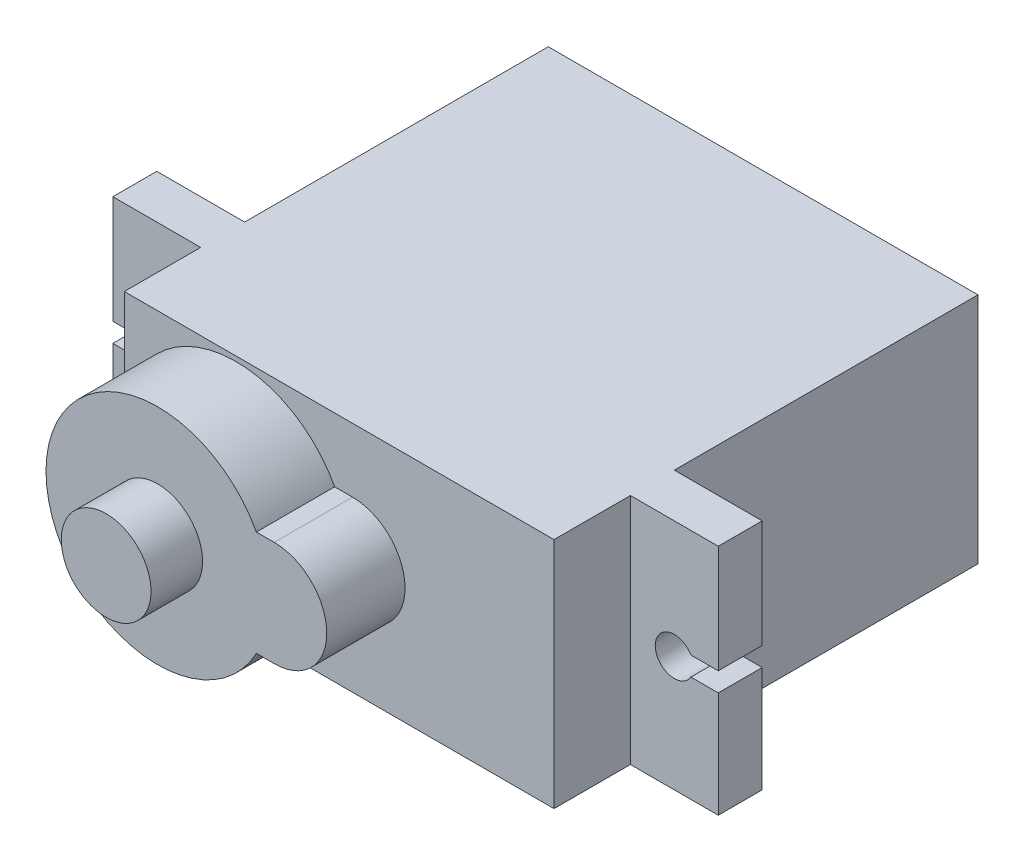
ISO-10303-21;
HEADER;
FILE_DESCRIPTION(('STEP AP214'),'2;1');
FILE_NAME('part.step','',(''),(''),'','','');
FILE_SCHEMA(('AUTOMOTIVE_DESIGN { 1 0 10303 214 1 1 1 1 }'));
ENDSEC;
DATA;
#1=APPLICATION_CONTEXT('core data for automotive mechanical design processes');
#2=APPLICATION_PROTOCOL_DEFINITION('international standard','automotive_design',2000,#1);
#3=PRODUCT_CONTEXT('',#1,'mechanical');
#4=PRODUCT('Part','Part','',(#3));
#5=PRODUCT_RELATED_PRODUCT_CATEGORY('part','',(#4));
#6=PRODUCT_DEFINITION_FORMATION('','',#4);
#7=PRODUCT_DEFINITION_CONTEXT('part definition',#1,'design');
#8=PRODUCT_DEFINITION('design','',#6,#7);
#9=PRODUCT_DEFINITION_SHAPE('','',#8);
#10=(LENGTH_UNIT() NAMED_UNIT(*) SI_UNIT(.MILLI.,.METRE.));
#11=(NAMED_UNIT(*) PLANE_ANGLE_UNIT() SI_UNIT($,.RADIAN.));
#12=(NAMED_UNIT(*) SI_UNIT($,.STERADIAN.) SOLID_ANGLE_UNIT());
#13=UNCERTAINTY_MEASURE_WITH_UNIT(LENGTH_MEASURE(1.E-05),#10,'distance_accuracy_value','');
#14=(GEOMETRIC_REPRESENTATION_CONTEXT(3) GLOBAL_UNCERTAINTY_ASSIGNED_CONTEXT((#13)) GLOBAL_UNIT_ASSIGNED_CONTEXT((#10,
#11,#12)) REPRESENTATION_CONTEXT('',''));
#15=CARTESIAN_POINT('',(0.,0.,0.));
#16=DIRECTION('',(0.,0.,1.));
#17=DIRECTION('',(1.,0.,0.));
#18=AXIS2_PLACEMENT_3D('',#15,#16,#17);
#19=CARTESIAN_POINT('',(4.37910958904109,0.,0.));
#20=DIRECTION('',(-1.,0.,0.));
#21=DIRECTION('',(0.,-1.,0.));
#22=AXIS2_PLACEMENT_3D('',#19,#20,#21);
#23=PLANE('',#22);
#24=DIRECTION('',(0.,1.,0.));
#25=VECTOR('',#24,1.);
#26=CARTESIAN_POINT('',(4.37910958904109,-12.4754901960784,15.9));
#27=LINE('',#26,#25);
#28=CARTESIAN_POINT('',(4.37910958904109,-12.4754901960784,15.9));
#29=VERTEX_POINT('',#28);
#30=CARTESIAN_POINT('',(4.3791095890411,-6.92549019607845,15.9));
#31=VERTEX_POINT('',#30);
#32=EDGE_CURVE('E232',#29,#31,#27,.T.);
#33=ORIENTED_EDGE('',*,*,#32,.T.);
#34=DIRECTION('',(0.,0.,1.));
#35=VECTOR('',#34,1.);
#36=CARTESIAN_POINT('',(4.3791095890411,-6.92549019607845,12.041243723685));
#37=LINE('',#36,#35);
#38=CARTESIAN_POINT('',(4.3791095890411,-6.92549019607845,18.2));
#39=VERTEX_POINT('',#38);
#40=EDGE_CURVE('E215',#31,#39,#37,.T.);
#41=ORIENTED_EDGE('',*,*,#40,.T.);
#42=DIRECTION('',(0.,-1.,0.));
#43=VECTOR('',#42,1.);
#44=CARTESIAN_POINT('',(4.37910958904109,-12.4754901960784,18.2));
#45=LINE('',#44,#43);
#46=CARTESIAN_POINT('',(4.37910958904109,-12.4754901960784,18.2));
#47=VERTEX_POINT('',#46);
#48=EDGE_CURVE('E343',#39,#47,#45,.T.);
#49=ORIENTED_EDGE('',*,*,#48,.T.);
#50=DIRECTION('',(0.,0.,-1.));
#51=VECTOR('',#50,1.);
#52=CARTESIAN_POINT('',(4.37910958904109,-12.4754901960784,18.2));
#53=LINE('',#52,#51);
#54=EDGE_CURVE('E238',#47,#29,#53,.T.);
#55=ORIENTED_EDGE('',*,*,#54,.T.);
#56=EDGE_LOOP('',(#33,#41,#49,#55));
#57=FACE_BOUND('',#56,.T.);
#58=ADVANCED_FACE('F48',(#57),#23,.F.);
#59=CARTESIAN_POINT('',(-27.3208904109589,-0.27549019607844,22.2));
#60=DIRECTION('',(1.,0.,0.));
#61=DIRECTION('',(0.,0.,-1.));
#62=AXIS2_PLACEMENT_3D('',#59,#60,#61);
#63=PLANE('',#62);
#64=DIRECTION('',(0.,-1.,0.));
#65=VECTOR('',#64,1.);
#66=CARTESIAN_POINT('',(-27.3208904109589,-12.4754901960784,15.9));
#67=LINE('',#66,#65);
#68=CARTESIAN_POINT('',(-27.3208904109589,-0.27549019607844,15.9));
#69=VERTEX_POINT('',#68);
#70=CARTESIAN_POINT('',(-27.3208904109589,-5.92549019607844,15.9));
#71=VERTEX_POINT('',#70);
#72=EDGE_CURVE('E248',#69,#71,#67,.T.);
#73=ORIENTED_EDGE('',*,*,#72,.T.);
#74=DIRECTION('',(0.,0.,1.));
#75=VECTOR('',#74,1.);
#76=CARTESIAN_POINT('',(-27.3208904109589,-5.92549019607844,12.041243723685));
#77=LINE('',#76,#75);
#78=CARTESIAN_POINT('',(-27.3208904109589,-5.92549019607844,18.2));
#79=VERTEX_POINT('',#78);
#80=EDGE_CURVE('E388',#71,#79,#77,.T.);
#81=ORIENTED_EDGE('',*,*,#80,.T.);
#82=DIRECTION('',(0.,1.,0.));
#83=VECTOR('',#82,1.);
#84=CARTESIAN_POINT('',(-27.3208904109589,-12.4754901960784,18.2));
#85=LINE('',#84,#83);
#86=CARTESIAN_POINT('',(-27.3208904109589,-0.275490196078443,18.2));
#87=VERTEX_POINT('',#86);
#88=EDGE_CURVE('E254',#79,#87,#85,.T.);
#89=ORIENTED_EDGE('',*,*,#88,.T.);
#90=DIRECTION('',(0.,0.,-1.));
#91=VECTOR('',#90,1.);
#92=CARTESIAN_POINT('',(-27.3208904109589,-0.275490196078443,18.2));
#93=LINE('',#92,#91);
#94=EDGE_CURVE('E251',#87,#69,#93,.T.);
#95=ORIENTED_EDGE('',*,*,#94,.T.);
#96=EDGE_LOOP('',(#73,#81,#89,#95));
#97=FACE_BOUND('',#96,.T.);
#98=ADVANCED_FACE('F516',(#97),#63,.F.);
#99=CARTESIAN_POINT('',(-22.7208904109589,-0.27549019607844,22.2));
#100=DIRECTION('',(1.,0.,0.));
#101=DIRECTION('',(0.,0.,-1.));
#102=AXIS2_PLACEMENT_3D('',#99,#100,#101);
#103=PLANE('',#102);
#104=DIRECTION('',(0.,0.,-1.));
#105=VECTOR('',#104,1.);
#106=CARTESIAN_POINT('',(-22.7208904109589,-0.27549019607844,22.2));
#107=LINE('',#106,#105);
#108=CARTESIAN_POINT('',(-22.7208904109589,-0.27549019607844,22.2));
#109=VERTEX_POINT('',#108);
#110=CARTESIAN_POINT('',(-22.7208904109589,-0.275490196078442,18.2));
#111=VERTEX_POINT('',#110);
#112=EDGE_CURVE('E306',#109,#111,#107,.T.);
#113=ORIENTED_EDGE('',*,*,#112,.T.);
#114=DIRECTION('',(0.,-1.,0.));
#115=VECTOR('',#114,1.);
#116=CARTESIAN_POINT('',(-22.7208904109589,-0.27549019607844,18.2));
#117=LINE('',#116,#115);
#118=CARTESIAN_POINT('',(-22.7208904109589,-12.4754901960784,18.2));
#119=VERTEX_POINT('',#118);
#120=EDGE_CURVE('E280',#111,#119,#117,.T.);
#121=ORIENTED_EDGE('',*,*,#120,.T.);
#122=DIRECTION('',(0.,0.,-1.));
#123=VECTOR('',#122,1.);
#124=CARTESIAN_POINT('',(-22.7208904109589,-12.4754901960784,22.2));
#125=LINE('',#124,#123);
#126=CARTESIAN_POINT('',(-22.7208904109589,-12.4754901960784,22.2));
#127=VERTEX_POINT('',#126);
#128=EDGE_CURVE('E52',#127,#119,#125,.T.);
#129=ORIENTED_EDGE('',*,*,#128,.F.);
#130=DIRECTION('',(0.,-1.,0.));
#131=VECTOR('',#130,1.);
#132=CARTESIAN_POINT('',(-22.7208904109589,-0.27549019607844,22.2));
#133=LINE('',#132,#131);
#134=CARTESIAN_POINT('',(-22.7208904109589,-6.37549019607844,22.2));
#135=VERTEX_POINT('',#134);
#136=EDGE_CURVE('E288',#135,#127,#133,.T.);
#137=ORIENTED_EDGE('',*,*,#136,.F.);
#138=EDGE_CURVE('E284',#109,#135,#133,.T.);
#139=ORIENTED_EDGE('',*,*,#138,.F.);
#140=EDGE_LOOP('',(#113,#121,#129,#137,#139));
#141=FACE_BOUND('',#140,.T.);
#142=ADVANCED_FACE('F453',(#141),#103,.F.);
#143=CARTESIAN_POINT('',(-0.220890410958909,-0.27549019607844,22.2));
#144=DIRECTION('',(-1.,0.,0.));
#145=DIRECTION('',(0.,-1.,0.));
#146=AXIS2_PLACEMENT_3D('',#143,#144,#145);
#147=PLANE('',#146);
#148=DIRECTION('',(0.,0.,-1.));
#149=VECTOR('',#148,1.);
#150=CARTESIAN_POINT('',(-0.220890410958906,-12.4754901960784,22.2));
#151=LINE('',#150,#149);
#152=CARTESIAN_POINT('',(-0.220890410958906,-12.4754901960784,22.2));
#153=VERTEX_POINT('',#152);
#154=CARTESIAN_POINT('',(-0.220890410958906,-12.4754901960784,18.2));
#155=VERTEX_POINT('',#154);
#156=EDGE_CURVE('E313',#153,#155,#151,.T.);
#157=ORIENTED_EDGE('',*,*,#156,.T.);
#158=DIRECTION('',(0.,1.,0.));
#159=VECTOR('',#158,1.);
#160=CARTESIAN_POINT('',(-0.220890410958909,-0.27549019607844,18.2));
#161=LINE('',#160,#159);
#162=CARTESIAN_POINT('',(-0.220890410958909,-0.27549019607844,18.2));
#163=VERTEX_POINT('',#162);
#164=EDGE_CURVE('E278',#155,#163,#161,.T.);
#165=ORIENTED_EDGE('',*,*,#164,.T.);
#166=DIRECTION('',(0.,0.,-1.));
#167=VECTOR('',#166,1.);
#168=CARTESIAN_POINT('',(-0.220890410958909,-0.27549019607844,22.2));
#169=LINE('',#168,#167);
#170=CARTESIAN_POINT('',(-0.220890410958909,-0.27549019607844,22.2));
#171=VERTEX_POINT('',#170);
#172=EDGE_CURVE('E310',#171,#163,#169,.T.);
#173=ORIENTED_EDGE('',*,*,#172,.F.);
#174=DIRECTION('',(0.,1.,0.));
#175=VECTOR('',#174,1.);
#176=CARTESIAN_POINT('',(-0.220890410958909,-0.27549019607844,22.2));
#177=LINE('',#176,#175);
#178=EDGE_CURVE('E290',#153,#171,#177,.T.);
#179=ORIENTED_EDGE('',*,*,#178,.F.);
#180=EDGE_LOOP('',(#157,#165,#173,#179));
#181=FACE_BOUND('',#180,.T.);
#182=ADVANCED_FACE('F452',(#181),#147,.F.);
#183=CARTESIAN_POINT('',(-22.7208904109589,-7.92549019607844,4.45));
#184=DIRECTION('',(1.,0.,0.));
#185=DIRECTION('',(0.,0.,-1.));
#186=AXIS2_PLACEMENT_3D('',#183,#184,#185);
#187=CIRCLE('',#186,0.749999999999999);
#188=CARTESIAN_POINT('',(-22.7208904109589,-7.92549019607844,3.7));
#189=VERTEX_POINT('',#188);
#190=EDGE_CURVE('E434',#189,#189,#187,.T.);
#191=ORIENTED_EDGE('',*,*,#190,.T.);
#192=EDGE_LOOP('',(#191));
#193=FACE_BOUND('',#192,.T.);
#194=CARTESIAN_POINT('',(-22.7208904109589,-4.82549019607844,4.45));
#195=DIRECTION('',(1.,0.,0.));
#196=DIRECTION('',(0.,0.,-1.));
#197=AXIS2_PLACEMENT_3D('',#194,#195,#196);
#198=CIRCLE('',#197,0.749999999999999);
#199=CARTESIAN_POINT('',(-22.7208904109589,-4.82549019607844,3.7));
#200=VERTEX_POINT('',#199);
#201=EDGE_CURVE('E428',#200,#200,#198,.T.);
#202=ORIENTED_EDGE('',*,*,#201,.T.);
#203=EDGE_LOOP('',(#202));
#204=FACE_BOUND('',#203,.T.);
#205=CARTESIAN_POINT('',(-22.7208904109589,-6.37549019607844,4.45));
#206=DIRECTION('',(1.,0.,0.));
#207=DIRECTION('',(0.,0.,-1.));
#208=AXIS2_PLACEMENT_3D('',#205,#206,#207);
#209=CIRCLE('',#208,0.749999999999998);
#210=CARTESIAN_POINT('',(-22.7208904109589,-6.37549019607844,3.70000000000001));
#211=VERTEX_POINT('',#210);
#212=EDGE_CURVE('E420',#211,#211,#209,.T.);
#213=ORIENTED_EDGE('',*,*,#212,.T.);
#214=EDGE_LOOP('',(#213));
#215=FACE_BOUND('',#214,.T.);
#216=CARTESIAN_POINT('',(-22.7208904109589,-12.4754901960784,15.9));
#217=VERTEX_POINT('',#216);
#218=CARTESIAN_POINT('',(-22.7208904109589,-12.4754901960784,0.));
#219=VERTEX_POINT('',#218);
#220=EDGE_CURVE('E314',#217,#219,#125,.T.);
#221=ORIENTED_EDGE('',*,*,#220,.F.);
#222=DIRECTION('',(0.,1.,0.));
#223=VECTOR('',#222,1.);
#224=CARTESIAN_POINT('',(-22.7208904109589,-0.27549019607844,15.9));
#225=LINE('',#224,#223);
#226=CARTESIAN_POINT('',(-22.7208904109589,-0.275490196078442,15.9));
#227=VERTEX_POINT('',#226);
#228=EDGE_CURVE('E275',#217,#227,#225,.T.);
#229=ORIENTED_EDGE('',*,*,#228,.T.);
#230=CARTESIAN_POINT('',(-22.7208904109589,-0.27549019607844,0.));
#231=VERTEX_POINT('',#230);
#232=EDGE_CURVE('E294',#227,#231,#107,.T.);
#233=ORIENTED_EDGE('',*,*,#232,.T.);
#234=DIRECTION('',(0.,-1.,0.));
#235=VECTOR('',#234,1.);
#236=CARTESIAN_POINT('',(-22.7208904109589,-0.27549019607844,0.));
#237=LINE('',#236,#235);
#238=EDGE_CURVE('E283',#231,#219,#237,.T.);
#239=ORIENTED_EDGE('',*,*,#238,.T.);
#240=EDGE_LOOP('',(#221,#229,#233,#239));
#241=FACE_BOUND('',#240,.T.);
#242=ADVANCED_FACE('F50',(#193,#204,#215,#241),#103,.F.);
#243=CARTESIAN_POINT('',(-22.7208904109589,-12.4754901960784,22.2));
#244=DIRECTION('',(0.,1.,0.));
#245=DIRECTION('',(0.,0.,1.));
#246=AXIS2_PLACEMENT_3D('',#243,#244,#245);
#247=PLANE('',#246);
#248=CARTESIAN_POINT('',(-0.220890410958907,-12.4754901960784,15.9));
#249=VERTEX_POINT('',#248);
#250=CARTESIAN_POINT('',(-0.220890410958906,-12.4754901960784,0.));
#251=VERTEX_POINT('',#250);
#252=EDGE_CURVE('E312',#249,#251,#151,.T.);
#253=ORIENTED_EDGE('',*,*,#252,.F.);
#254=DIRECTION('',(1.,0.,0.));
#255=VECTOR('',#254,1.);
#256=CARTESIAN_POINT('',(-44.335800801292,-12.4754901960784,15.9));
#257=LINE('',#256,#255);
#258=EDGE_CURVE('E268',#249,#29,#257,.T.);
#259=ORIENTED_EDGE('',*,*,#258,.T.);
#260=ORIENTED_EDGE('',*,*,#54,.F.);
#261=DIRECTION('',(1.,0.,0.));
#262=VECTOR('',#261,1.);
#263=CARTESIAN_POINT('',(-44.335800801292,-12.4754901960784,18.2));
#264=LINE('',#263,#262);
#265=EDGE_CURVE('E243',#155,#47,#264,.T.);
#266=ORIENTED_EDGE('',*,*,#265,.F.);
#267=ORIENTED_EDGE('',*,*,#156,.F.);
#268=DIRECTION('',(1.,0.,0.));
#269=VECTOR('',#268,1.);
#270=CARTESIAN_POINT('',(-22.7208904109589,-12.4754901960784,22.2));
#271=LINE('',#270,#269);
#272=EDGE_CURVE('E287',#127,#153,#271,.T.);
#273=ORIENTED_EDGE('',*,*,#272,.F.);
#274=ORIENTED_EDGE('',*,*,#128,.T.);
#275=CARTESIAN_POINT('',(-27.3208904109589,-12.4754901960784,18.2));
#276=VERTEX_POINT('',#275);
#277=EDGE_CURVE('E269',#276,#119,#264,.T.);
#278=ORIENTED_EDGE('',*,*,#277,.F.);
#279=DIRECTION('',(0.,0.,1.));
#280=VECTOR('',#279,1.);
#281=CARTESIAN_POINT('',(-27.3208904109589,-12.4754901960784,18.2));
#282=LINE('',#281,#280);
#283=CARTESIAN_POINT('',(-27.3208904109589,-12.4754901960784,15.9));
#284=VERTEX_POINT('',#283);
#285=EDGE_CURVE('E258',#284,#276,#282,.T.);
#286=ORIENTED_EDGE('',*,*,#285,.F.);
#287=EDGE_CURVE('E266',#284,#217,#257,.T.);
#288=ORIENTED_EDGE('',*,*,#287,.T.);
#289=ORIENTED_EDGE('',*,*,#220,.T.);
#290=DIRECTION('',(1.,0.,0.));
#291=VECTOR('',#290,1.);
#292=CARTESIAN_POINT('',(-22.7208904109589,-12.4754901960784,0.));
#293=LINE('',#292,#291);
#294=EDGE_CURVE('E297',#219,#251,#293,.T.);
#295=ORIENTED_EDGE('',*,*,#294,.T.);
#296=EDGE_LOOP('',(#253,#259,#260,#266,#267,#273,#274,#278,#286,#288,#289,#295));
#297=FACE_BOUND('',#296,.T.);
#298=ADVANCED_FACE('F326',(#297),#247,.F.);
#299=CARTESIAN_POINT('',(-0.220890410958909,-0.27549019607844,15.9));
#300=VERTEX_POINT('',#299);
#301=CARTESIAN_POINT('',(-0.220890410958909,-0.27549019607844,0.));
#302=VERTEX_POINT('',#301);
#303=EDGE_CURVE('E309',#300,#302,#169,.T.);
#304=ORIENTED_EDGE('',*,*,#303,.F.);
#305=DIRECTION('',(0.,-1.,0.));
#306=VECTOR('',#305,1.);
#307=CARTESIAN_POINT('',(-0.220890410958909,-0.27549019607844,15.9));
#308=LINE('',#307,#306);
#309=EDGE_CURVE('E272',#300,#249,#308,.T.);
#310=ORIENTED_EDGE('',*,*,#309,.T.);
#311=ORIENTED_EDGE('',*,*,#252,.T.);
#312=DIRECTION('',(0.,1.,0.));
#313=VECTOR('',#312,1.);
#314=CARTESIAN_POINT('',(-0.220890410958909,-0.27549019607844,0.));
#315=LINE('',#314,#313);
#316=EDGE_CURVE('E300',#251,#302,#315,.T.);
#317=ORIENTED_EDGE('',*,*,#316,.T.);
#318=EDGE_LOOP('',(#304,#310,#311,#317));
#319=FACE_BOUND('',#318,.T.);
#320=ADVANCED_FACE('F320',(#319),#147,.F.);
#321=CARTESIAN_POINT('',(-22.7208904109589,-0.27549019607844,22.2));
#322=DIRECTION('',(0.,-1.,0.));
#323=DIRECTION('',(0.,0.,-1.));
#324=AXIS2_PLACEMENT_3D('',#321,#322,#323);
#325=PLANE('',#324);
#326=ORIENTED_EDGE('',*,*,#232,.F.);
#327=DIRECTION('',(1.,0.,0.));
#328=VECTOR('',#327,1.);
#329=CARTESIAN_POINT('',(-44.335800801292,-0.275490196078445,15.9));
#330=LINE('',#329,#328);
#331=EDGE_CURVE('E263',#69,#227,#330,.T.);
#332=ORIENTED_EDGE('',*,*,#331,.F.);
#333=ORIENTED_EDGE('',*,*,#94,.F.);
#334=DIRECTION('',(1.,0.,0.));
#335=VECTOR('',#334,1.);
#336=CARTESIAN_POINT('',(-44.335800801292,-0.275490196078445,18.2));
#337=LINE('',#336,#335);
#338=EDGE_CURVE('E259',#87,#111,#337,.T.);
#339=ORIENTED_EDGE('',*,*,#338,.T.);
#340=ORIENTED_EDGE('',*,*,#112,.F.);
#341=DIRECTION('',(-1.,0.,0.));
#342=VECTOR('',#341,1.);
#343=CARTESIAN_POINT('',(-22.7208904109589,-0.27549019607844,22.2));
#344=LINE('',#343,#342);
#345=EDGE_CURVE('E292',#171,#109,#344,.T.);
#346=ORIENTED_EDGE('',*,*,#345,.F.);
#347=ORIENTED_EDGE('',*,*,#172,.T.);
#348=CARTESIAN_POINT('',(4.37910958904109,-0.275490196078439,18.2));
#349=VERTEX_POINT('',#348);
#350=EDGE_CURVE('E262',#163,#349,#337,.T.);
#351=ORIENTED_EDGE('',*,*,#350,.T.);
#352=DIRECTION('',(0.,0.,1.));
#353=VECTOR('',#352,1.);
#354=CARTESIAN_POINT('',(4.37910958904109,-0.275490196078439,18.2));
#355=LINE('',#354,#353);
#356=CARTESIAN_POINT('',(4.37910958904109,-0.275490196078439,15.9));
#357=VERTEX_POINT('',#356);
#358=EDGE_CURVE('E239',#357,#349,#355,.T.);
#359=ORIENTED_EDGE('',*,*,#358,.F.);
#360=EDGE_CURVE('E265',#300,#357,#330,.T.);
#361=ORIENTED_EDGE('',*,*,#360,.F.);
#362=ORIENTED_EDGE('',*,*,#303,.T.);
#363=DIRECTION('',(-1.,0.,0.));
#364=VECTOR('',#363,1.);
#365=CARTESIAN_POINT('',(-22.7208904109589,-0.27549019607844,0.));
#366=LINE('',#365,#364);
#367=EDGE_CURVE('E303',#302,#231,#366,.T.);
#368=ORIENTED_EDGE('',*,*,#367,.T.);
#369=EDGE_LOOP('',(#326,#332,#333,#339,#340,#346,#347,#351,#359,#361,#362,#368));
#370=FACE_BOUND('',#369,.T.);
#371=ADVANCED_FACE('F333',(#370),#325,.F.);
#372=CARTESIAN_POINT('',(0.,0.,22.2));
#373=DIRECTION('',(0.,0.,1.));
#374=DIRECTION('',(1.,0.,0.));
#375=AXIS2_PLACEMENT_3D('',#372,#373,#374);
#376=PLANE('',#375);
#377=DIRECTION('',(1.,0.,0.));
#378=VECTOR('',#377,1.);
#379=CARTESIAN_POINT('',(-10.7708904109589,-9.12549019607844,22.2));
#380=LINE('',#379,#378);
#381=CARTESIAN_POINT('',(-11.7075581535887,-9.12549019607844,22.2));
#382=VERTEX_POINT('',#381);
#383=CARTESIAN_POINT('',(-10.7708904109589,-9.12549019607844,22.2));
#384=VERTEX_POINT('',#383);
#385=EDGE_CURVE('E361',#382,#384,#380,.T.);
#386=ORIENTED_EDGE('',*,*,#385,.F.);
#387=CARTESIAN_POINT('',(-16.8708904109589,-6.37549019607844,22.2));
#388=DIRECTION('',(0.,0.,1.));
#389=DIRECTION('',(1.,0.,0.));
#390=AXIS2_PLACEMENT_3D('',#387,#388,#389);
#391=CIRCLE('',#390,5.85);
#392=EDGE_CURVE('E14',#135,#382,#391,.T.);
#393=ORIENTED_EDGE('',*,*,#392,.F.);
#394=ORIENTED_EDGE('',*,*,#136,.T.);
#395=ORIENTED_EDGE('',*,*,#272,.T.);
#396=ORIENTED_EDGE('',*,*,#178,.T.);
#397=ORIENTED_EDGE('',*,*,#345,.T.);
#398=ORIENTED_EDGE('',*,*,#138,.T.);
#399=CARTESIAN_POINT('',(-11.7075581535887,-3.62549019607844,22.2));
#400=VERTEX_POINT('',#399);
#401=EDGE_CURVE('E58',#400,#135,#391,.T.);
#402=ORIENTED_EDGE('',*,*,#401,.F.);
#403=DIRECTION('',(-1.,0.,0.));
#404=VECTOR('',#403,1.);
#405=CARTESIAN_POINT('',(-10.7708904109589,-3.62549019607844,22.2));
#406=LINE('',#405,#404);
#407=CARTESIAN_POINT('',(-10.7708904109589,-3.62549019607844,22.2));
#408=VERTEX_POINT('',#407);
#409=EDGE_CURVE('E366',#408,#400,#406,.T.);
#410=ORIENTED_EDGE('',*,*,#409,.F.);
#411=CARTESIAN_POINT('',(-10.7708904109589,-6.37549019607844,22.2));
#412=DIRECTION('',(0.,0.,1.));
#413=DIRECTION('',(1.,0.,0.));
#414=AXIS2_PLACEMENT_3D('',#411,#412,#413);
#415=CIRCLE('',#414,2.75);
#416=EDGE_CURVE('E369',#384,#408,#415,.T.);
#417=ORIENTED_EDGE('',*,*,#416,.F.);
#418=EDGE_LOOP('',(#386,#393,#394,#395,#396,#397,#398,#402,#410,#417));
#419=FACE_BOUND('',#418,.T.);
#420=ADVANCED_FACE('F482',(#419),#376,.T.);
#421=CARTESIAN_POINT('',(0.,0.,0.));
#422=DIRECTION('',(0.,0.,1.));
#423=DIRECTION('',(1.,0.,0.));
#424=AXIS2_PLACEMENT_3D('',#421,#422,#423);
#425=PLANE('',#424);
#426=ORIENTED_EDGE('',*,*,#238,.F.);
#427=ORIENTED_EDGE('',*,*,#367,.F.);
#428=ORIENTED_EDGE('',*,*,#316,.F.);
#429=ORIENTED_EDGE('',*,*,#294,.F.);
#430=EDGE_LOOP('',(#426,#427,#428,#429));
#431=FACE_BOUND('',#430,.T.);
#432=ADVANCED_FACE('F330',(#431),#425,.F.);
#433=CARTESIAN_POINT('',(4.3791095890411,-5.92549019607844,18.2));
#434=VERTEX_POINT('',#433);
#435=EDGE_CURVE('E341',#349,#434,#45,.T.);
#436=ORIENTED_EDGE('',*,*,#435,.T.);
#437=DIRECTION('',(0.,0.,1.));
#438=VECTOR('',#437,1.);
#439=CARTESIAN_POINT('',(4.3791095890411,-5.92549019607844,12.041243723685));
#440=LINE('',#439,#438);
#441=CARTESIAN_POINT('',(4.3791095890411,-5.92549019607844,15.9));
#442=VERTEX_POINT('',#441);
#443=EDGE_CURVE('E225',#442,#434,#440,.T.);
#444=ORIENTED_EDGE('',*,*,#443,.F.);
#445=EDGE_CURVE('E240',#442,#357,#27,.T.);
#446=ORIENTED_EDGE('',*,*,#445,.T.);
#447=ORIENTED_EDGE('',*,*,#358,.T.);
#448=EDGE_LOOP('',(#436,#444,#446,#447));
#449=FACE_BOUND('',#448,.T.);
#450=ADVANCED_FACE('F518',(#449),#23,.F.);
#451=CARTESIAN_POINT('',(-44.335800801292,-12.4754901960784,15.9));
#452=DIRECTION('',(0.,0.,-1.));
#453=DIRECTION('',(-1.,0.,0.));
#454=AXIS2_PLACEMENT_3D('',#451,#452,#453);
#455=PLANE('',#454);
#456=DIRECTION('',(1.,0.,0.));
#457=VECTOR('',#456,1.);
#458=CARTESIAN_POINT('',(4.3791095890411,-6.92549019607845,15.9));
#459=LINE('',#458,#457);
#460=CARTESIAN_POINT('',(2.94513499282555,-6.92549019607845,15.9));
#461=VERTEX_POINT('',#460);
#462=EDGE_CURVE('E218',#461,#31,#459,.T.);
#463=ORIENTED_EDGE('',*,*,#462,.T.);
#464=ORIENTED_EDGE('',*,*,#32,.F.);
#465=ORIENTED_EDGE('',*,*,#258,.F.);
#466=ORIENTED_EDGE('',*,*,#309,.F.);
#467=ORIENTED_EDGE('',*,*,#360,.T.);
#468=ORIENTED_EDGE('',*,*,#445,.F.);
#469=DIRECTION('',(-1.,0.,0.));
#470=VECTOR('',#469,1.);
#471=CARTESIAN_POINT('',(4.3791095890411,-5.92549019607844,15.9));
#472=LINE('',#471,#470);
#473=CARTESIAN_POINT('',(2.94513499282555,-5.92549019607843,15.9));
#474=VERTEX_POINT('',#473);
#475=EDGE_CURVE('E412',#442,#474,#472,.T.);
#476=ORIENTED_EDGE('',*,*,#475,.T.);
#477=CARTESIAN_POINT('',(2.0791095890411,-6.42549019607844,15.9));
#478=DIRECTION('',(0.,0.,-1.));
#479=DIRECTION('',(-1.,0.,0.));
#480=AXIS2_PLACEMENT_3D('',#477,#478,#479);
#481=CIRCLE('',#480,1.00000000000002);
#482=EDGE_CURVE('E234',#474,#461,#481,.F.);
#483=ORIENTED_EDGE('',*,*,#482,.T.);
#484=EDGE_LOOP('',(#463,#464,#465,#466,#467,#468,#476,#483));
#485=FACE_BOUND('',#484,.T.);
#486=ADVANCED_FACE('F230',(#485),#455,.T.);
#487=CARTESIAN_POINT('',(-44.335800801292,-12.4754901960784,18.2));
#488=DIRECTION('',(0.,0.,1.));
#489=DIRECTION('',(1.,0.,0.));
#490=AXIS2_PLACEMENT_3D('',#487,#488,#489);
#491=PLANE('',#490);
#492=DIRECTION('',(1.,0.,0.));
#493=VECTOR('',#492,1.);
#494=CARTESIAN_POINT('',(4.3791095890411,-6.92549019607845,18.2));
#495=LINE('',#494,#493);
#496=CARTESIAN_POINT('',(2.94513499282555,-6.92549019607845,18.2));
#497=VERTEX_POINT('',#496);
#498=EDGE_CURVE('E221',#497,#39,#495,.T.);
#499=ORIENTED_EDGE('',*,*,#498,.F.);
#500=CARTESIAN_POINT('',(2.0791095890411,-6.42549019607844,18.2));
#501=DIRECTION('',(0.,0.,1.));
#502=DIRECTION('',(-1.,0.,0.));
#503=AXIS2_PLACEMENT_3D('',#500,#501,#502);
#504=CIRCLE('',#503,1.00000000000002);
#505=CARTESIAN_POINT('',(2.94513499282555,-5.92549019607843,18.2));
#506=VERTEX_POINT('',#505);
#507=EDGE_CURVE('E417',#506,#497,#504,.T.);
#508=ORIENTED_EDGE('',*,*,#507,.F.);
#509=DIRECTION('',(-1.,0.,0.));
#510=VECTOR('',#509,1.);
#511=CARTESIAN_POINT('',(4.3791095890411,-5.92549019607844,18.2));
#512=LINE('',#511,#510);
#513=EDGE_CURVE('E65',#434,#506,#512,.T.);
#514=ORIENTED_EDGE('',*,*,#513,.F.);
#515=ORIENTED_EDGE('',*,*,#435,.F.);
#516=ORIENTED_EDGE('',*,*,#350,.F.);
#517=ORIENTED_EDGE('',*,*,#164,.F.);
#518=ORIENTED_EDGE('',*,*,#265,.T.);
#519=ORIENTED_EDGE('',*,*,#48,.F.);
#520=EDGE_LOOP('',(#499,#508,#514,#515,#516,#517,#518,#519));
#521=FACE_BOUND('',#520,.T.);
#522=ADVANCED_FACE('F530',(#521),#491,.T.);
#523=DIRECTION('',(-1.,0.,0.));
#524=VECTOR('',#523,1.);
#525=CARTESIAN_POINT('',(-27.3208904109589,-5.92549019607844,18.2));
#526=LINE('',#525,#524);
#527=CARTESIAN_POINT('',(-25.8869158147434,-5.92549019607844,18.2));
#528=VERTEX_POINT('',#527);
#529=EDGE_CURVE('E405',#528,#79,#526,.T.);
#530=ORIENTED_EDGE('',*,*,#529,.F.);
#531=CARTESIAN_POINT('',(-25.0208904109589,-6.42549019607844,18.2));
#532=DIRECTION('',(0.,0.,1.));
#533=DIRECTION('',(1.,0.,0.));
#534=AXIS2_PLACEMENT_3D('',#531,#532,#533);
#535=CIRCLE('',#534,1.00000000000002);
#536=CARTESIAN_POINT('',(-25.8869158147434,-6.92549019607845,18.2));
#537=VERTEX_POINT('',#536);
#538=EDGE_CURVE('E402',#537,#528,#535,.T.);
#539=ORIENTED_EDGE('',*,*,#538,.F.);
#540=DIRECTION('',(1.,0.,0.));
#541=VECTOR('',#540,1.);
#542=CARTESIAN_POINT('',(-27.3208904109589,-6.92549019607845,18.2));
#543=LINE('',#542,#541);
#544=CARTESIAN_POINT('',(-27.3208904109589,-6.92549019607845,18.2));
#545=VERTEX_POINT('',#544);
#546=EDGE_CURVE('E401',#545,#537,#543,.T.);
#547=ORIENTED_EDGE('',*,*,#546,.F.);
#548=EDGE_CURVE('E255',#276,#545,#85,.T.);
#549=ORIENTED_EDGE('',*,*,#548,.F.);
#550=ORIENTED_EDGE('',*,*,#277,.T.);
#551=ORIENTED_EDGE('',*,*,#120,.F.);
#552=ORIENTED_EDGE('',*,*,#338,.F.);
#553=ORIENTED_EDGE('',*,*,#88,.F.);
#554=EDGE_LOOP('',(#530,#539,#547,#549,#550,#551,#552,#553));
#555=FACE_BOUND('',#554,.T.);
#556=ADVANCED_FACE('F472',(#555),#491,.T.);
#557=DIRECTION('',(-1.,0.,0.));
#558=VECTOR('',#557,1.);
#559=CARTESIAN_POINT('',(-27.3208904109589,-5.92549019607844,15.9));
#560=LINE('',#559,#558);
#561=CARTESIAN_POINT('',(-25.8869158147434,-5.92549019607844,15.9));
#562=VERTEX_POINT('',#561);
#563=EDGE_CURVE('E392',#562,#71,#560,.T.);
#564=ORIENTED_EDGE('',*,*,#563,.T.);
#565=ORIENTED_EDGE('',*,*,#72,.F.);
#566=ORIENTED_EDGE('',*,*,#331,.T.);
#567=ORIENTED_EDGE('',*,*,#228,.F.);
#568=ORIENTED_EDGE('',*,*,#287,.F.);
#569=CARTESIAN_POINT('',(-27.3208904109589,-6.92549019607845,15.9));
#570=VERTEX_POINT('',#569);
#571=EDGE_CURVE('E252',#570,#284,#67,.T.);
#572=ORIENTED_EDGE('',*,*,#571,.F.);
#573=DIRECTION('',(1.,0.,0.));
#574=VECTOR('',#573,1.);
#575=CARTESIAN_POINT('',(-27.3208904109589,-6.92549019607845,15.9));
#576=LINE('',#575,#574);
#577=CARTESIAN_POINT('',(-25.8869158147434,-6.92549019607845,15.9));
#578=VERTEX_POINT('',#577);
#579=EDGE_CURVE('E73',#570,#578,#576,.T.);
#580=ORIENTED_EDGE('',*,*,#579,.T.);
#581=CARTESIAN_POINT('',(-25.0208904109589,-6.42549019607844,15.9));
#582=DIRECTION('',(0.,0.,-1.));
#583=DIRECTION('',(-1.,0.,0.));
#584=AXIS2_PLACEMENT_3D('',#581,#582,#583);
#585=CIRCLE('',#584,1.00000000000002);
#586=EDGE_CURVE('E387',#578,#562,#585,.F.);
#587=ORIENTED_EDGE('',*,*,#586,.T.);
#588=EDGE_LOOP('',(#564,#565,#566,#567,#568,#572,#580,#587));
#589=FACE_BOUND('',#588,.T.);
#590=ADVANCED_FACE('F461',(#589),#455,.T.);
#591=ORIENTED_EDGE('',*,*,#548,.T.);
#592=DIRECTION('',(0.,0.,1.));
#593=VECTOR('',#592,1.);
#594=CARTESIAN_POINT('',(-27.3208904109589,-6.92549019607845,12.041243723685));
#595=LINE('',#594,#593);
#596=EDGE_CURVE('E391',#570,#545,#595,.T.);
#597=ORIENTED_EDGE('',*,*,#596,.F.);
#598=ORIENTED_EDGE('',*,*,#571,.T.);
#599=ORIENTED_EDGE('',*,*,#285,.T.);
#600=EDGE_LOOP('',(#591,#597,#598,#599));
#601=FACE_BOUND('',#600,.T.);
#602=ADVANCED_FACE('F523',(#601),#63,.F.);
#603=CARTESIAN_POINT('',(-10.7708904109589,-6.37549019607844,26.3));
#604=DIRECTION('',(0.,0.,-1.));
#605=DIRECTION('',(-1.,0.,0.));
#606=AXIS2_PLACEMENT_3D('',#603,#604,#605);
#607=CYLINDRICAL_SURFACE('',#606,2.75);
#608=ORIENTED_EDGE('',*,*,#416,.T.);
#609=DIRECTION('',(0.,0.,-1.));
#610=VECTOR('',#609,1.);
#611=CARTESIAN_POINT('',(-10.7708904109589,-3.62549019607844,26.3));
#612=LINE('',#611,#610);
#613=CARTESIAN_POINT('',(-10.7708904109589,-3.62549019607844,26.3));
#614=VERTEX_POINT('',#613);
#615=EDGE_CURVE('E347',#614,#408,#612,.T.);
#616=ORIENTED_EDGE('',*,*,#615,.F.);
#617=CARTESIAN_POINT('',(-10.7708904109589,-6.37549019607844,26.3));
#618=DIRECTION('',(0.,0.,1.));
#619=DIRECTION('',(1.,0.,0.));
#620=AXIS2_PLACEMENT_3D('',#617,#618,#619);
#621=CIRCLE('',#620,2.75);
#622=CARTESIAN_POINT('',(-10.7708904109589,-9.12549019607844,26.3));
#623=VERTEX_POINT('',#622);
#624=EDGE_CURVE('E363',#623,#614,#621,.T.);
#625=ORIENTED_EDGE('',*,*,#624,.F.);
#626=DIRECTION('',(0.,0.,-1.));
#627=VECTOR('',#626,1.);
#628=CARTESIAN_POINT('',(-10.7708904109589,-9.12549019607844,26.3));
#629=LINE('',#628,#627);
#630=EDGE_CURVE('E357',#623,#384,#629,.T.);
#631=ORIENTED_EDGE('',*,*,#630,.T.);
#632=EDGE_LOOP('',(#608,#616,#625,#631));
#633=FACE_BOUND('',#632,.T.);
#634=ADVANCED_FACE('F499',(#633),#607,.T.);
#635=CARTESIAN_POINT('',(-10.7708904109589,-3.62549019607844,26.3));
#636=DIRECTION('',(0.,-1.,0.));
#637=DIRECTION('',(0.,0.,-1.));
#638=AXIS2_PLACEMENT_3D('',#635,#636,#637);
#639=PLANE('',#638);
#640=ORIENTED_EDGE('',*,*,#409,.T.);
#641=DIRECTION('',(0.,0.,-1.));
#642=VECTOR('',#641,1.);
#643=CARTESIAN_POINT('',(-11.7075581535887,-3.62549019607844,26.3));
#644=LINE('',#643,#642);
#645=CARTESIAN_POINT('',(-11.7075581535887,-3.62549019607844,26.3));
#646=VERTEX_POINT('',#645);
#647=EDGE_CURVE('E351',#646,#400,#644,.T.);
#648=ORIENTED_EDGE('',*,*,#647,.F.);
#649=DIRECTION('',(-1.,0.,0.));
#650=VECTOR('',#649,1.);
#651=CARTESIAN_POINT('',(-10.7708904109589,-3.62549019607844,26.3));
#652=LINE('',#651,#650);
#653=EDGE_CURVE('E376',#614,#646,#652,.T.);
#654=ORIENTED_EDGE('',*,*,#653,.F.);
#655=ORIENTED_EDGE('',*,*,#615,.T.);
#656=EDGE_LOOP('',(#640,#648,#654,#655));
#657=FACE_BOUND('',#656,.T.);
#658=ADVANCED_FACE('F491',(#657),#639,.F.);
#659=CARTESIAN_POINT('',(-16.8708904109589,-6.37549019607844,26.3));
#660=DIRECTION('',(0.,0.,-1.));
#661=DIRECTION('',(-1.,0.,0.));
#662=AXIS2_PLACEMENT_3D('',#659,#660,#661);
#663=CYLINDRICAL_SURFACE('',#662,5.85);
#664=ORIENTED_EDGE('',*,*,#401,.T.);
#665=ORIENTED_EDGE('',*,*,#392,.T.);
#666=DIRECTION('',(0.,0.,-1.));
#667=VECTOR('',#666,1.);
#668=CARTESIAN_POINT('',(-11.7075581535887,-9.12549019607844,26.3));
#669=LINE('',#668,#667);
#670=CARTESIAN_POINT('',(-11.7075581535887,-9.12549019607844,26.3));
#671=VERTEX_POINT('',#670);
#672=EDGE_CURVE('E354',#671,#382,#669,.T.);
#673=ORIENTED_EDGE('',*,*,#672,.F.);
#674=CARTESIAN_POINT('',(-16.8708904109589,-6.37549019607844,26.3));
#675=DIRECTION('',(0.,0.,1.));
#676=DIRECTION('',(1.,0.,0.));
#677=AXIS2_PLACEMENT_3D('',#674,#675,#676);
#678=CIRCLE('',#677,5.85);
#679=EDGE_CURVE('E374',#646,#671,#678,.T.);
#680=ORIENTED_EDGE('',*,*,#679,.F.);
#681=ORIENTED_EDGE('',*,*,#647,.T.);
#682=EDGE_LOOP('',(#664,#665,#673,#680,#681));
#683=FACE_BOUND('',#682,.T.);
#684=ADVANCED_FACE('F486',(#683),#663,.T.);
#685=CARTESIAN_POINT('',(-10.7708904109589,-9.12549019607844,26.3));
#686=DIRECTION('',(0.,1.,0.));
#687=DIRECTION('',(0.,0.,1.));
#688=AXIS2_PLACEMENT_3D('',#685,#686,#687);
#689=PLANE('',#688);
#690=ORIENTED_EDGE('',*,*,#385,.T.);
#691=ORIENTED_EDGE('',*,*,#630,.F.);
#692=DIRECTION('',(1.,0.,0.));
#693=VECTOR('',#692,1.);
#694=CARTESIAN_POINT('',(-10.7708904109589,-9.12549019607844,26.3));
#695=LINE('',#694,#693);
#696=EDGE_CURVE('E360',#671,#623,#695,.T.);
#697=ORIENTED_EDGE('',*,*,#696,.F.);
#698=ORIENTED_EDGE('',*,*,#672,.T.);
#699=EDGE_LOOP('',(#690,#691,#697,#698));
#700=FACE_BOUND('',#699,.T.);
#701=ADVANCED_FACE('F496',(#700),#689,.F.);
#702=CARTESIAN_POINT('',(-10.7708904109589,-6.37549019607844,26.3));
#703=DIRECTION('',(0.,0.,1.));
#704=DIRECTION('',(1.,0.,0.));
#705=AXIS2_PLACEMENT_3D('',#702,#703,#704);
#706=PLANE('',#705);
#707=CARTESIAN_POINT('',(-16.8708904109589,-6.37549019607844,26.3));
#708=DIRECTION('',(0.,0.,1.));
#709=DIRECTION('',(1.,0.,0.));
#710=AXIS2_PLACEMENT_3D('',#707,#708,#709);
#711=CIRCLE('',#710,2.35);
#712=CARTESIAN_POINT('',(-19.2208904109589,-6.37549019607844,26.3));
#713=VERTEX_POINT('',#712);
#714=EDGE_CURVE('E380',#713,#713,#711,.T.);
#715=ORIENTED_EDGE('',*,*,#714,.F.);
#716=EDGE_LOOP('',(#715));
#717=FACE_BOUND('',#716,.T.);
#718=ORIENTED_EDGE('',*,*,#624,.T.);
#719=ORIENTED_EDGE('',*,*,#653,.T.);
#720=ORIENTED_EDGE('',*,*,#679,.T.);
#721=ORIENTED_EDGE('',*,*,#696,.T.);
#722=EDGE_LOOP('',(#718,#719,#720,#721));
#723=FACE_BOUND('',#722,.T.);
#724=ADVANCED_FACE('F501',(#717,#723),#706,.T.);
#725=CARTESIAN_POINT('',(-16.8708904109589,-6.37549019607844,29.));
#726=DIRECTION('',(0.,0.,-1.));
#727=DIRECTION('',(-1.,0.,0.));
#728=AXIS2_PLACEMENT_3D('',#725,#726,#727);
#729=CYLINDRICAL_SURFACE('',#728,2.35);
#730=CARTESIAN_POINT('',(-16.8708904109589,-6.37549019607844,29.));
#731=DIRECTION('',(0.,0.,1.));
#732=DIRECTION('',(1.,0.,0.));
#733=AXIS2_PLACEMENT_3D('',#730,#731,#732);
#734=CIRCLE('',#733,2.35);
#735=CARTESIAN_POINT('',(-19.2208904109589,-6.37549019607844,29.));
#736=VERTEX_POINT('',#735);
#737=EDGE_CURVE('E372',#736,#736,#734,.T.);
#738=CARTESIAN_POINT('',(-19.2208904109589,-6.37549019607844,29.));
#739=CARTESIAN_POINT('',(-19.2208904109589,-6.37549019607844,28.971875));
#740=CARTESIAN_POINT('',(-19.2208904109589,-6.37549019607844,28.94375));
#741=CARTESIAN_POINT('',(-19.2208904109589,-6.37549019607844,28.8875));
#742=CARTESIAN_POINT('',(-19.2208904109589,-6.37549019607844,28.859375));
#743=CARTESIAN_POINT('',(-19.2208904109589,-6.37549019607844,28.803125));
#744=CARTESIAN_POINT('',(-19.2208904109589,-6.37549019607844,28.775));
#745=CARTESIAN_POINT('',(-19.2208904109589,-6.37549019607844,28.71875));
#746=CARTESIAN_POINT('',(-19.2208904109589,-6.37549019607844,28.690625));
#747=CARTESIAN_POINT('',(-19.2208904109589,-6.37549019607844,28.634375));
#748=CARTESIAN_POINT('',(-19.2208904109589,-6.37549019607844,28.60625));
#749=CARTESIAN_POINT('',(-19.2208904109589,-6.37549019607844,28.55));
#750=CARTESIAN_POINT('',(-19.2208904109589,-6.37549019607844,28.521875));
#751=CARTESIAN_POINT('',(-19.2208904109589,-6.37549019607844,28.465625));
#752=CARTESIAN_POINT('',(-19.2208904109589,-6.37549019607844,28.4375));
#753=CARTESIAN_POINT('',(-19.2208904109589,-6.37549019607844,28.38125));
#754=CARTESIAN_POINT('',(-19.2208904109589,-6.37549019607844,28.353125));
#755=CARTESIAN_POINT('',(-19.2208904109589,-6.37549019607844,28.296875));
#756=CARTESIAN_POINT('',(-19.2208904109589,-6.37549019607844,28.26875));
#757=CARTESIAN_POINT('',(-19.2208904109589,-6.37549019607844,28.2125));
#758=CARTESIAN_POINT('',(-19.2208904109589,-6.37549019607844,28.184375));
#759=CARTESIAN_POINT('',(-19.2208904109589,-6.37549019607844,28.128125));
#760=CARTESIAN_POINT('',(-19.2208904109589,-6.37549019607844,28.1));
#761=CARTESIAN_POINT('',(-19.2208904109589,-6.37549019607844,28.04375));
#762=CARTESIAN_POINT('',(-19.2208904109589,-6.37549019607844,28.015625));
#763=CARTESIAN_POINT('',(-19.2208904109589,-6.37549019607844,27.959375));
#764=CARTESIAN_POINT('',(-19.2208904109589,-6.37549019607844,27.93125));
#765=CARTESIAN_POINT('',(-19.2208904109589,-6.37549019607844,27.875));
#766=CARTESIAN_POINT('',(-19.2208904109589,-6.37549019607844,27.846875));
#767=CARTESIAN_POINT('',(-19.2208904109589,-6.37549019607844,27.790625));
#768=CARTESIAN_POINT('',(-19.2208904109589,-6.37549019607844,27.7625));
#769=CARTESIAN_POINT('',(-19.2208904109589,-6.37549019607844,27.70625));
#770=CARTESIAN_POINT('',(-19.2208904109589,-6.37549019607844,27.678125));
#771=CARTESIAN_POINT('',(-19.2208904109589,-6.37549019607844,27.621875));
#772=CARTESIAN_POINT('',(-19.2208904109589,-6.37549019607844,27.59375));
#773=CARTESIAN_POINT('',(-19.2208904109589,-6.37549019607844,27.5375));
#774=CARTESIAN_POINT('',(-19.2208904109589,-6.37549019607844,27.509375));
#775=CARTESIAN_POINT('',(-19.2208904109589,-6.37549019607844,27.453125));
#776=CARTESIAN_POINT('',(-19.2208904109589,-6.37549019607844,27.425));
#777=CARTESIAN_POINT('',(-19.2208904109589,-6.37549019607844,27.36875));
#778=CARTESIAN_POINT('',(-19.2208904109589,-6.37549019607844,27.340625));
#779=CARTESIAN_POINT('',(-19.2208904109589,-6.37549019607844,27.284375));
#780=CARTESIAN_POINT('',(-19.2208904109589,-6.37549019607844,27.25625));
#781=CARTESIAN_POINT('',(-19.2208904109589,-6.37549019607844,27.2));
#782=CARTESIAN_POINT('',(-19.2208904109589,-6.37549019607844,27.171875));
#783=CARTESIAN_POINT('',(-19.2208904109589,-6.37549019607844,27.115625));
#784=CARTESIAN_POINT('',(-19.2208904109589,-6.37549019607844,27.0875));
#785=CARTESIAN_POINT('',(-19.2208904109589,-6.37549019607844,27.03125));
#786=CARTESIAN_POINT('',(-19.2208904109589,-6.37549019607844,27.003125));
#787=CARTESIAN_POINT('',(-19.2208904109589,-6.37549019607844,26.946875));
#788=CARTESIAN_POINT('',(-19.2208904109589,-6.37549019607844,26.91875));
#789=CARTESIAN_POINT('',(-19.2208904109589,-6.37549019607844,26.8625));
#790=CARTESIAN_POINT('',(-19.2208904109589,-6.37549019607844,26.834375));
#791=CARTESIAN_POINT('',(-19.2208904109589,-6.37549019607844,26.778125));
#792=CARTESIAN_POINT('',(-19.2208904109589,-6.37549019607844,26.75));
#793=CARTESIAN_POINT('',(-19.2208904109589,-6.37549019607844,26.69375));
#794=CARTESIAN_POINT('',(-19.2208904109589,-6.37549019607844,26.665625));
#795=CARTESIAN_POINT('',(-19.2208904109589,-6.37549019607844,26.609375));
#796=CARTESIAN_POINT('',(-19.2208904109589,-6.37549019607844,26.58125));
#797=CARTESIAN_POINT('',(-19.2208904109589,-6.37549019607844,26.525));
#798=CARTESIAN_POINT('',(-19.2208904109589,-6.37549019607844,26.496875));
#799=CARTESIAN_POINT('',(-19.2208904109589,-6.37549019607844,26.440625));
#800=CARTESIAN_POINT('',(-19.2208904109589,-6.37549019607844,26.4125));
#801=CARTESIAN_POINT('',(-19.2208904109589,-6.37549019607844,26.35625));
#802=CARTESIAN_POINT('',(-19.2208904109589,-6.37549019607844,26.328125));
#803=CARTESIAN_POINT('',(-19.2208904109589,-6.37549019607844,26.3));
#804=B_SPLINE_CURVE_WITH_KNOTS('',3,(#738,#739,#740,#741,#742,#743,#744,#745,#746,#747,#748,
#749,#750,#751,#752,#753,#754,#755,#756,#757,#758,#759,#760,#761,#762,#763,#764,#765,#766,#767,
#768,#769,#770,#771,#772,#773,#774,#775,#776,#777,#778,#779,#780,#781,#782,#783,#784,#785,#786,
#787,#788,#789,#790,#791,#792,#793,#794,#795,#796,#797,#798,#799,#800,#801,#802,#803),
.UNSPECIFIED.,.F.,.F.,(4,2,2,2,2,2,2,2,2,2,2,2,2,2,2,2,2,2,2,2,2,2,2,2,2,2,2,2,2,2,2,2,4),(0.,
0.0843749999999976,0.168749999999999,0.253125,0.337499999999998,0.421874999999999,0.50625,
0.590624999999997,0.674999999999998,0.759375,0.843749999999997,0.928124999999998,1.0125,
1.096875,1.18125,1.265625,1.35,1.434375,1.51875,1.603125,1.6875,1.771875,1.85625,1.940625,2.025,
2.109375,2.19375,2.278125,2.3625,2.446875,2.53125,2.615625,2.7),.UNSPECIFIED.);
#805=EDGE_CURVE('BSEAM503',#736,#713,#804,.T.);
#806=ORIENTED_EDGE('',*,*,#737,.F.);
#807=ORIENTED_EDGE('',*,*,#714,.T.);
#808=ORIENTED_EDGE('',*,*,#805,.T.);
#809=ORIENTED_EDGE('',*,*,#805,.F.);
#810=EDGE_LOOP('',(#806,#808,#807,#809));
#811=FACE_BOUND('',#810,.T.);
#812=ADVANCED_FACE('F503',(#811),#729,.T.);
#813=CARTESIAN_POINT('',(-16.8708904109589,-6.37549019607844,29.));
#814=DIRECTION('',(0.,0.,1.));
#815=DIRECTION('',(1.,0.,0.));
#816=AXIS2_PLACEMENT_3D('',#813,#814,#815);
#817=PLANE('',#816);
#818=ORIENTED_EDGE('',*,*,#737,.T.);
#819=EDGE_LOOP('',(#818));
#820=FACE_BOUND('',#819,.T.);
#821=ADVANCED_FACE('F510',(#820),#817,.T.);
#822=CARTESIAN_POINT('',(-27.3208904109589,-5.92549019607844,12.041243723685));
#823=DIRECTION('',(0.,1.,0.));
#824=DIRECTION('',(-1.,0.,0.));
#825=AXIS2_PLACEMENT_3D('',#822,#823,#824);
#826=PLANE('',#825);
#827=DIRECTION('',(0.,0.,1.));
#828=VECTOR('',#827,1.);
#829=CARTESIAN_POINT('',(-25.8869158147434,-5.92549019607844,12.041243723685));
#830=LINE('',#829,#828);
#831=EDGE_CURVE('E383',#562,#528,#830,.T.);
#832=ORIENTED_EDGE('',*,*,#831,.T.);
#833=ORIENTED_EDGE('',*,*,#529,.T.);
#834=ORIENTED_EDGE('',*,*,#80,.F.);
#835=ORIENTED_EDGE('',*,*,#563,.F.);
#836=EDGE_LOOP('',(#832,#833,#834,#835));
#837=FACE_BOUND('',#836,.T.);
#838=ADVANCED_FACE('F617',(#837),#826,.F.);
#839=CARTESIAN_POINT('',(-27.3208904109589,-6.92549019607845,12.041243723685));
#840=DIRECTION('',(0.,-1.,0.));
#841=DIRECTION('',(1.,0.,0.));
#842=AXIS2_PLACEMENT_3D('',#839,#840,#841);
#843=PLANE('',#842);
#844=ORIENTED_EDGE('',*,*,#596,.T.);
#845=ORIENTED_EDGE('',*,*,#546,.T.);
#846=DIRECTION('',(0.,0.,1.));
#847=VECTOR('',#846,1.);
#848=CARTESIAN_POINT('',(-25.8869158147434,-6.92549019607845,12.041243723685));
#849=LINE('',#848,#847);
#850=EDGE_CURVE('E394',#578,#537,#849,.T.);
#851=ORIENTED_EDGE('',*,*,#850,.F.);
#852=ORIENTED_EDGE('',*,*,#579,.F.);
#853=EDGE_LOOP('',(#844,#845,#851,#852));
#854=FACE_BOUND('',#853,.T.);
#855=ADVANCED_FACE('F677',(#854),#843,.F.);
#856=CARTESIAN_POINT('',(-25.0208904109589,-6.42549019607844,12.041243723685));
#857=DIRECTION('',(0.,0.,1.));
#858=DIRECTION('',(1.,0.,0.));
#859=AXIS2_PLACEMENT_3D('',#856,#857,#858);
#860=CYLINDRICAL_SURFACE('',#859,1.00000000000002);
#861=ORIENTED_EDGE('',*,*,#850,.T.);
#862=ORIENTED_EDGE('',*,*,#538,.T.);
#863=ORIENTED_EDGE('',*,*,#831,.F.);
#864=ORIENTED_EDGE('',*,*,#586,.F.);
#865=EDGE_LOOP('',(#861,#862,#863,#864));
#866=FACE_BOUND('',#865,.T.);
#867=ADVANCED_FACE('F687',(#866),#860,.F.);
#868=CARTESIAN_POINT('',(4.3791095890411,-6.92549019607845,12.041243723685));
#869=DIRECTION('',(0.,-1.,0.));
#870=DIRECTION('',(1.,0.,0.));
#871=AXIS2_PLACEMENT_3D('',#868,#869,#870);
#872=PLANE('',#871);
#873=DIRECTION('',(0.,0.,1.));
#874=VECTOR('',#873,1.);
#875=CARTESIAN_POINT('',(2.94513499282555,-6.92549019607845,12.041243723685));
#876=LINE('',#875,#874);
#877=EDGE_CURVE('E406',#461,#497,#876,.T.);
#878=ORIENTED_EDGE('',*,*,#877,.T.);
#879=ORIENTED_EDGE('',*,*,#498,.T.);
#880=ORIENTED_EDGE('',*,*,#40,.F.);
#881=ORIENTED_EDGE('',*,*,#462,.F.);
#882=EDGE_LOOP('',(#878,#879,#880,#881));
#883=FACE_BOUND('',#882,.T.);
#884=ADVANCED_FACE('F217',(#883),#872,.F.);
#885=CARTESIAN_POINT('',(4.3791095890411,-5.92549019607844,12.041243723685));
#886=DIRECTION('',(0.,1.,0.));
#887=DIRECTION('',(-1.,0.,0.));
#888=AXIS2_PLACEMENT_3D('',#885,#886,#887);
#889=PLANE('',#888);
#890=ORIENTED_EDGE('',*,*,#443,.T.);
#891=ORIENTED_EDGE('',*,*,#513,.T.);
#892=DIRECTION('',(0.,0.,1.));
#893=VECTOR('',#892,1.);
#894=CARTESIAN_POINT('',(2.94513499282555,-5.92549019607843,12.041243723685));
#895=LINE('',#894,#893);
#896=EDGE_CURVE('E413',#474,#506,#895,.T.);
#897=ORIENTED_EDGE('',*,*,#896,.F.);
#898=ORIENTED_EDGE('',*,*,#475,.F.);
#899=EDGE_LOOP('',(#890,#891,#897,#898));
#900=FACE_BOUND('',#899,.T.);
#901=ADVANCED_FACE('F705',(#900),#889,.F.);
#902=CARTESIAN_POINT('',(2.0791095890411,-6.42549019607844,12.041243723685));
#903=DIRECTION('',(0.,0.,1.));
#904=DIRECTION('',(1.,0.,0.));
#905=AXIS2_PLACEMENT_3D('',#902,#903,#904);
#906=CYLINDRICAL_SURFACE('',#905,1.00000000000002);
#907=ORIENTED_EDGE('',*,*,#896,.T.);
#908=ORIENTED_EDGE('',*,*,#507,.T.);
#909=ORIENTED_EDGE('',*,*,#877,.F.);
#910=ORIENTED_EDGE('',*,*,#482,.F.);
#911=EDGE_LOOP('',(#907,#908,#909,#910));
#912=FACE_BOUND('',#911,.T.);
#913=ADVANCED_FACE('F714',(#912),#906,.F.);
#914=CARTESIAN_POINT('',(-30.8422107545185,-6.37549019607844,4.45));
#915=DIRECTION('',(1.,0.,0.));
#916=DIRECTION('',(0.,1.,0.));
#917=AXIS2_PLACEMENT_3D('',#914,#915,#916);
#918=CYLINDRICAL_SURFACE('',#917,0.749999999999998);
#919=CARTESIAN_POINT('',(-25.7208904109589,-6.37549019607844,4.45));
#920=DIRECTION('',(1.,0.,0.));
#921=DIRECTION('',(0.,0.,-1.));
#922=AXIS2_PLACEMENT_3D('',#919,#920,#921);
#923=CIRCLE('',#922,0.749999999999998);
#924=CARTESIAN_POINT('',(-25.7208904109589,-6.37549019607844,3.70000000000001));
#925=VERTEX_POINT('',#924);
#926=EDGE_CURVE('E425',#925,#925,#923,.F.);
#927=ORIENTED_EDGE('',*,*,#926,.F.);
#928=EDGE_LOOP('',(#927));
#929=FACE_BOUND('',#928,.T.);
#930=ORIENTED_EDGE('',*,*,#212,.F.);
#931=EDGE_LOOP('',(#930));
#932=FACE_BOUND('',#931,.T.);
#933=ADVANCED_FACE('F722',(#929,#932),#918,.T.);
#934=CARTESIAN_POINT('',(-25.7208904109589,-0.27549019607844,22.2));
#935=DIRECTION('',(1.,0.,0.));
#936=DIRECTION('',(0.,0.,-1.));
#937=AXIS2_PLACEMENT_3D('',#934,#935,#936);
#938=PLANE('',#937);
#939=ORIENTED_EDGE('',*,*,#926,.T.);
#940=EDGE_LOOP('',(#939));
#941=FACE_BOUND('',#940,.T.);
#942=ADVANCED_FACE('F765',(#941),#938,.F.);
#943=CARTESIAN_POINT('',(-30.8422107545185,-4.82549019607844,4.45));
#944=DIRECTION('',(1.,0.,0.));
#945=DIRECTION('',(0.,1.,0.));
#946=AXIS2_PLACEMENT_3D('',#943,#944,#945);
#947=CYLINDRICAL_SURFACE('',#946,0.749999999999999);
#948=CARTESIAN_POINT('',(-25.7208904109589,-4.82549019607844,4.45));
#949=DIRECTION('',(1.,0.,0.));
#950=DIRECTION('',(0.,0.,-1.));
#951=AXIS2_PLACEMENT_3D('',#948,#949,#950);
#952=CIRCLE('',#951,0.749999999999999);
#953=CARTESIAN_POINT('',(-25.7208904109589,-4.82549019607844,3.7));
#954=VERTEX_POINT('',#953);
#955=EDGE_CURVE('E431',#954,#954,#952,.F.);
#956=ORIENTED_EDGE('',*,*,#955,.F.);
#957=EDGE_LOOP('',(#956));
#958=FACE_BOUND('',#957,.T.);
#959=ORIENTED_EDGE('',*,*,#201,.F.);
#960=EDGE_LOOP('',(#959));
#961=FACE_BOUND('',#960,.T.);
#962=ADVANCED_FACE('F773',(#958,#961),#947,.T.);
#963=CARTESIAN_POINT('',(-25.7208904109589,-0.27549019607844,22.2));
#964=DIRECTION('',(1.,0.,0.));
#965=DIRECTION('',(0.,0.,-1.));
#966=AXIS2_PLACEMENT_3D('',#963,#964,#965);
#967=PLANE('',#966);
#968=ORIENTED_EDGE('',*,*,#955,.T.);
#969=EDGE_LOOP('',(#968));
#970=FACE_BOUND('',#969,.T.);
#971=ADVANCED_FACE('F446',(#970),#967,.F.);
#972=CARTESIAN_POINT('',(-30.8422107545185,-7.92549019607844,4.45));
#973=DIRECTION('',(1.,0.,0.));
#974=DIRECTION('',(0.,1.,0.));
#975=AXIS2_PLACEMENT_3D('',#972,#973,#974);
#976=CYLINDRICAL_SURFACE('',#975,0.749999999999999);
#977=CARTESIAN_POINT('',(-25.7208904109589,-7.92549019607844,4.45));
#978=DIRECTION('',(1.,0.,0.));
#979=DIRECTION('',(0.,0.,-1.));
#980=AXIS2_PLACEMENT_3D('',#977,#978,#979);
#981=CIRCLE('',#980,0.749999999999999);
#982=CARTESIAN_POINT('',(-25.7208904109589,-7.92549019607844,3.7));
#983=VERTEX_POINT('',#982);
#984=EDGE_CURVE('E437',#983,#983,#981,.F.);
#985=ORIENTED_EDGE('',*,*,#984,.F.);
#986=EDGE_LOOP('',(#985));
#987=FACE_BOUND('',#986,.T.);
#988=ORIENTED_EDGE('',*,*,#190,.F.);
#989=EDGE_LOOP('',(#988));
#990=FACE_BOUND('',#989,.T.);
#991=ADVANCED_FACE('F443',(#987,#990),#976,.T.);
#992=CARTESIAN_POINT('',(-25.7208904109589,-0.27549019607844,22.2));
#993=DIRECTION('',(1.,0.,0.));
#994=DIRECTION('',(0.,0.,-1.));
#995=AXIS2_PLACEMENT_3D('',#992,#993,#994);
#996=PLANE('',#995);
#997=ORIENTED_EDGE('',*,*,#984,.T.);
#998=EDGE_LOOP('',(#997));
#999=FACE_BOUND('',#998,.T.);
#1000=ADVANCED_FACE('F441',(#999),#996,.F.);
#1001=CLOSED_SHELL('',(#58,#98,#142,#182,#242,#298,#320,#371,#420,#432,#450,#486,#522,#556,#590,
#602,#634,#658,#684,#701,#724,#812,#821,#838,#855,#867,#884,#901,#913,#933,#942,#962,#971,#991,#1000));
#1002=MANIFOLD_SOLID_BREP('B2',#1001);
#1003=ADVANCED_BREP_SHAPE_REPRESENTATION('',(#18,#1002),#14);
#1004=SHAPE_DEFINITION_REPRESENTATION(#9,#1003);
ENDSEC;
END-ISO-10303-21;
